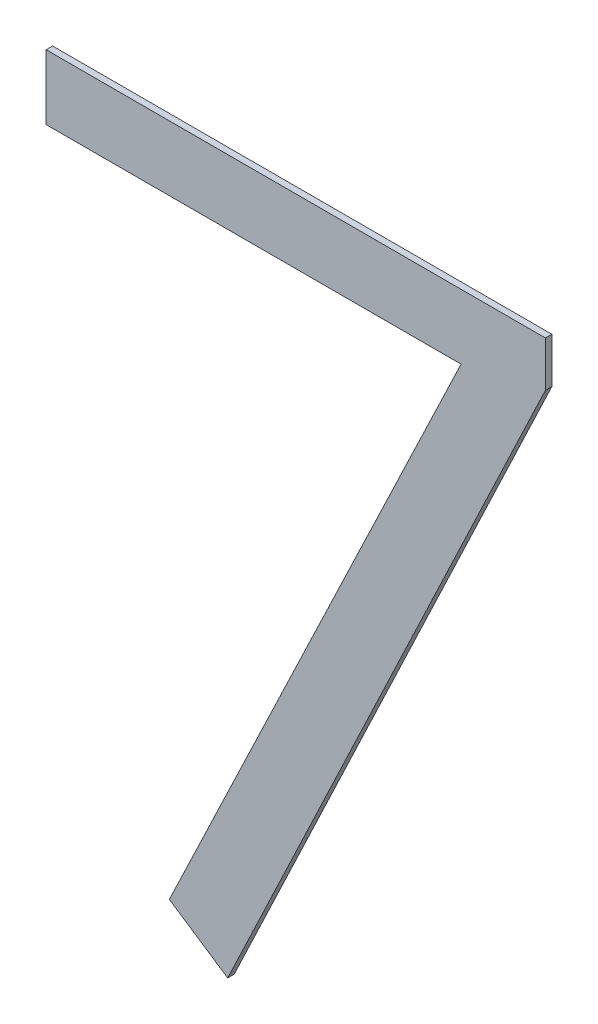
ISO-10303-21;
HEADER;
FILE_DESCRIPTION(('STEP AP214'),'2;1');
FILE_NAME('part.step','',(''),(''),'','','');
FILE_SCHEMA(('AUTOMOTIVE_DESIGN { 1 0 10303 214 1 1 1 1 }'));
ENDSEC;
DATA;
#1=APPLICATION_CONTEXT('core data for automotive mechanical design processes');
#2=APPLICATION_PROTOCOL_DEFINITION('international standard','automotive_design',2000,#1);
#3=PRODUCT_CONTEXT('',#1,'mechanical');
#4=PRODUCT('Part','Part','',(#3));
#5=PRODUCT_RELATED_PRODUCT_CATEGORY('part','',(#4));
#6=PRODUCT_DEFINITION_FORMATION('','',#4);
#7=PRODUCT_DEFINITION_CONTEXT('part definition',#1,'design');
#8=PRODUCT_DEFINITION('design','',#6,#7);
#9=PRODUCT_DEFINITION_SHAPE('','',#8);
#10=(LENGTH_UNIT() NAMED_UNIT(*) SI_UNIT(.MILLI.,.METRE.));
#11=(NAMED_UNIT(*) PLANE_ANGLE_UNIT() SI_UNIT($,.RADIAN.));
#12=(NAMED_UNIT(*) SI_UNIT($,.STERADIAN.) SOLID_ANGLE_UNIT());
#13=UNCERTAINTY_MEASURE_WITH_UNIT(LENGTH_MEASURE(1.E-05),#10,'distance_accuracy_value','');
#14=(GEOMETRIC_REPRESENTATION_CONTEXT(3) GLOBAL_UNCERTAINTY_ASSIGNED_CONTEXT((#13)) GLOBAL_UNIT_ASSIGNED_CONTEXT((#10,
#11,#12)) REPRESENTATION_CONTEXT('',''));
#15=CARTESIAN_POINT('',(0.,0.,0.));
#16=DIRECTION('',(0.,0.,1.));
#17=DIRECTION('',(1.,0.,0.));
#18=AXIS2_PLACEMENT_3D('',#15,#16,#17);
#19=CARTESIAN_POINT('',(-0.3850005,0.55000144,0.01));
#20=DIRECTION('',(0.,0.,1.));
#21=DIRECTION('',(1.,0.,0.));
#22=AXIS2_PLACEMENT_3D('',#19,#20,#21);
#23=PLANE('',#22);
#24=DIRECTION('',(0.,1.,0.));
#25=VECTOR('',#24,1.);
#26=CARTESIAN_POINT('',(0.3850005,0.55000144,0.01));
#27=LINE('',#26,#25);
#28=CARTESIAN_POINT('',(0.3850005,0.55000144,0.01));
#29=VERTEX_POINT('',#28);
#30=CARTESIAN_POINT('',(0.3850005,0.48000158,0.01));
#31=VERTEX_POINT('',#30);
#32=EDGE_CURVE('E107',#29,#31,#27,.F.);
#33=ORIENTED_EDGE('',*,*,#32,.F.);
#34=DIRECTION('',(1.,0.,0.));
#35=VECTOR('',#34,1.);
#36=CARTESIAN_POINT('',(-0.3850005,0.55000144,0.01));
#37=LINE('',#36,#35);
#38=CARTESIAN_POINT('',(-0.3850005,0.55000144,0.01));
#39=VERTEX_POINT('',#38);
#40=EDGE_CURVE('E88',#39,#29,#37,.T.);
#41=ORIENTED_EDGE('',*,*,#40,.F.);
#42=DIRECTION('',(0.,1.,0.));
#43=VECTOR('',#42,1.);
#44=CARTESIAN_POINT('',(-0.3850005,0.45000164,0.01));
#45=LINE('',#44,#43);
#46=CARTESIAN_POINT('',(-0.3850005,0.45000164,0.01));
#47=VERTEX_POINT('',#46);
#48=EDGE_CURVE('E20',#47,#39,#45,.T.);
#49=ORIENTED_EDGE('',*,*,#48,.F.);
#50=DIRECTION('',(1.,0.,0.));
#51=VECTOR('',#50,1.);
#52=CARTESIAN_POINT('',(0.25500076,0.45000164,0.01));
#53=LINE('',#52,#51);
#54=CARTESIAN_POINT('',(0.25500076000003,0.450001639999986,0.01));
#55=VERTEX_POINT('',#54);
#56=EDGE_CURVE('E77',#55,#47,#53,.F.);
#57=ORIENTED_EDGE('',*,*,#56,.F.);
#58=DIRECTION('',(-0.431796031455136,-0.901971278489285,0.));
#59=VECTOR('',#58,1.);
#60=CARTESIAN_POINT('',(-0.19500088,-0.48999902,0.01));
#61=LINE('',#60,#59);
#62=CARTESIAN_POINT('',(-0.195000879999996,-0.489999019999994,0.01));
#63=VERTEX_POINT('',#62);
#64=EDGE_CURVE('E72',#63,#55,#61,.F.);
#65=ORIENTED_EDGE('',*,*,#64,.F.);
#66=DIRECTION('',(0.83205751946603,-0.55468935838002,0.));
#67=VECTOR('',#66,1.);
#68=CARTESIAN_POINT('',(-0.10499852,-0.5499989,0.01));
#69=LINE('',#68,#67);
#70=CARTESIAN_POINT('',(-0.104998520000099,-0.549998899999953,0.01));
#71=VERTEX_POINT('',#70);
#72=EDGE_CURVE('E99',#71,#63,#69,.F.);
#73=ORIENTED_EDGE('',*,*,#72,.F.);
#74=DIRECTION('',(0.429592369181139,0.903022921271291,0.));
#75=VECTOR('',#74,1.);
#76=CARTESIAN_POINT('',(0.3850005,0.48000158,0.01));
#77=LINE('',#76,#75);
#78=EDGE_CURVE('E103',#31,#71,#77,.F.);
#79=ORIENTED_EDGE('',*,*,#78,.F.);
#80=EDGE_LOOP('',(#33,#41,#49,#57,#65,#73,#79));
#81=FACE_BOUND('',#80,.T.);
#82=ADVANCED_FACE('F17',(#81),#23,.T.);
#83=CARTESIAN_POINT('',(-0.3850005,0.45000164,0.));
#84=DIRECTION('',(-1.,0.,0.));
#85=DIRECTION('',(0.,0.,1.));
#86=AXIS2_PLACEMENT_3D('',#83,#84,#85);
#87=PLANE('',#86);
#88=DIRECTION('',(0.,0.,1.));
#89=VECTOR('',#88,1.);
#90=CARTESIAN_POINT('',(-0.3850005,0.55000144,0.));
#91=LINE('',#90,#89);
#92=CARTESIAN_POINT('',(-0.3850005,0.55000144,0.));
#93=VERTEX_POINT('',#92);
#94=EDGE_CURVE('E111',#93,#39,#91,.T.);
#95=ORIENTED_EDGE('',*,*,#94,.F.);
#96=DIRECTION('',(0.,1.,0.));
#97=VECTOR('',#96,1.);
#98=CARTESIAN_POINT('',(-0.3850005,0.55000144,0.));
#99=LINE('',#98,#97);
#100=CARTESIAN_POINT('',(-0.3850005,0.45000164,0.));
#101=VERTEX_POINT('',#100);
#102=EDGE_CURVE('E94',#93,#101,#99,.F.);
#103=ORIENTED_EDGE('',*,*,#102,.T.);
#104=DIRECTION('',(0.,0.,-1.));
#105=VECTOR('',#104,1.);
#106=CARTESIAN_POINT('',(-0.3850005,0.45000164,0.));
#107=LINE('',#106,#105);
#108=EDGE_CURVE('E82',#47,#101,#107,.T.);
#109=ORIENTED_EDGE('',*,*,#108,.F.);
#110=ORIENTED_EDGE('',*,*,#48,.T.);
#111=EDGE_LOOP('',(#95,#103,#109,#110));
#112=FACE_BOUND('',#111,.T.);
#113=ADVANCED_FACE('F93',(#112),#87,.T.);
#114=CARTESIAN_POINT('',(0.25500076,0.45000164,0.));
#115=DIRECTION('',(0.,-1.,0.));
#116=DIRECTION('',(0.,0.,-1.));
#117=AXIS2_PLACEMENT_3D('',#114,#115,#116);
#118=PLANE('',#117);
#119=ORIENTED_EDGE('',*,*,#108,.T.);
#120=DIRECTION('',(1.,0.,0.));
#121=VECTOR('',#120,1.);
#122=CARTESIAN_POINT('',(-0.3850005,0.45000164,0.));
#123=LINE('',#122,#121);
#124=CARTESIAN_POINT('',(0.25500076000003,0.450001639999986,0.));
#125=VERTEX_POINT('',#124);
#126=EDGE_CURVE('E116',#101,#125,#123,.T.);
#127=ORIENTED_EDGE('',*,*,#126,.T.);
#128=DIRECTION('',(0.,0.,1.));
#129=VECTOR('',#128,1.);
#130=CARTESIAN_POINT('',(0.255000760000121,0.450001639999942,0.));
#131=LINE('',#130,#129);
#132=EDGE_CURVE('E84',#55,#125,#131,.F.);
#133=ORIENTED_EDGE('',*,*,#132,.F.);
#134=ORIENTED_EDGE('',*,*,#56,.T.);
#135=EDGE_LOOP('',(#119,#127,#133,#134));
#136=FACE_BOUND('',#135,.T.);
#137=ADVANCED_FACE('F79',(#136),#118,.T.);
#138=CARTESIAN_POINT('',(-0.19500088,-0.48999902,0.));
#139=DIRECTION('',(-0.901971278489285,0.431796031455136,0.));
#140=DIRECTION('',(-0.431796031455136,-0.901971278489285,0.));
#141=AXIS2_PLACEMENT_3D('',#138,#139,#140);
#142=PLANE('',#141);
#143=ORIENTED_EDGE('',*,*,#132,.T.);
#144=DIRECTION('',(-0.43179603145502,-0.90197127848934,0.));
#145=VECTOR('',#144,1.);
#146=CARTESIAN_POINT('',(0.25500076,0.45000164,0.));
#147=LINE('',#146,#145);
#148=CARTESIAN_POINT('',(-0.195000879999996,-0.489999019999994,0.));
#149=VERTEX_POINT('',#148);
#150=EDGE_CURVE('E118',#125,#149,#147,.T.);
#151=ORIENTED_EDGE('',*,*,#150,.T.);
#152=DIRECTION('',(0.,0.,1.));
#153=VECTOR('',#152,1.);
#154=CARTESIAN_POINT('',(-0.195000879999984,-0.489999019999977,0.));
#155=LINE('',#154,#153);
#156=EDGE_CURVE('E101',#63,#149,#155,.F.);
#157=ORIENTED_EDGE('',*,*,#156,.F.);
#158=ORIENTED_EDGE('',*,*,#64,.T.);
#159=EDGE_LOOP('',(#143,#151,#157,#158));
#160=FACE_BOUND('',#159,.T.);
#161=ADVANCED_FACE('F144',(#160),#142,.T.);
#162=CARTESIAN_POINT('',(-0.10499852,-0.5499989,0.));
#163=DIRECTION('',(-0.55468935838002,-0.83205751946603,0.));
#164=DIRECTION('',(0.83205751946603,-0.55468935838002,0.));
#165=AXIS2_PLACEMENT_3D('',#162,#163,#164);
#166=PLANE('',#165);
#167=ORIENTED_EDGE('',*,*,#156,.T.);
#168=DIRECTION('',(0.832057519466175,-0.554689358379802,0.));
#169=VECTOR('',#168,1.);
#170=CARTESIAN_POINT('',(-0.19500088,-0.48999902,0.));
#171=LINE('',#170,#169);
#172=CARTESIAN_POINT('',(-0.104998520000099,-0.549998899999953,0.));
#173=VERTEX_POINT('',#172);
#174=EDGE_CURVE('E121',#149,#173,#171,.T.);
#175=ORIENTED_EDGE('',*,*,#174,.T.);
#176=DIRECTION('',(0.,0.,1.));
#177=VECTOR('',#176,1.);
#178=CARTESIAN_POINT('',(-0.104998520000397,-0.549998899999811,0.));
#179=LINE('',#178,#177);
#180=EDGE_CURVE('E105',#71,#173,#179,.F.);
#181=ORIENTED_EDGE('',*,*,#180,.F.);
#182=ORIENTED_EDGE('',*,*,#72,.T.);
#183=EDGE_LOOP('',(#167,#175,#181,#182));
#184=FACE_BOUND('',#183,.T.);
#185=ADVANCED_FACE('F142',(#184),#166,.T.);
#186=CARTESIAN_POINT('',(0.3850005,0.48000158,0.));
#187=DIRECTION('',(0.903022921271291,-0.429592369181139,0.));
#188=DIRECTION('',(0.429592369181139,0.903022921271291,0.));
#189=AXIS2_PLACEMENT_3D('',#186,#187,#188);
#190=PLANE('',#189);
#191=ORIENTED_EDGE('',*,*,#180,.T.);
#192=DIRECTION('',(0.42959236918079,0.903022921271457,0.));
#193=VECTOR('',#192,1.);
#194=CARTESIAN_POINT('',(-0.10499852,-0.5499989,0.));
#195=LINE('',#194,#193);
#196=CARTESIAN_POINT('',(0.3850005,0.48000158,0.));
#197=VERTEX_POINT('',#196);
#198=EDGE_CURVE('E124',#173,#197,#195,.T.);
#199=ORIENTED_EDGE('',*,*,#198,.T.);
#200=DIRECTION('',(0.,0.,-1.));
#201=VECTOR('',#200,1.);
#202=CARTESIAN_POINT('',(0.3850005,0.48000158,0.));
#203=LINE('',#202,#201);
#204=EDGE_CURVE('E109',#31,#197,#203,.T.);
#205=ORIENTED_EDGE('',*,*,#204,.F.);
#206=ORIENTED_EDGE('',*,*,#78,.T.);
#207=EDGE_LOOP('',(#191,#199,#205,#206));
#208=FACE_BOUND('',#207,.T.);
#209=ADVANCED_FACE('F137',(#208),#190,.T.);
#210=CARTESIAN_POINT('',(0.3850005,0.55000144,0.));
#211=DIRECTION('',(1.,0.,0.));
#212=DIRECTION('',(0.,0.,-1.));
#213=AXIS2_PLACEMENT_3D('',#210,#211,#212);
#214=PLANE('',#213);
#215=ORIENTED_EDGE('',*,*,#204,.T.);
#216=DIRECTION('',(0.,1.,0.));
#217=VECTOR('',#216,1.);
#218=CARTESIAN_POINT('',(0.3850005,0.55000144,0.));
#219=LINE('',#218,#217);
#220=CARTESIAN_POINT('',(0.3850005,0.55000144,0.));
#221=VERTEX_POINT('',#220);
#222=EDGE_CURVE('E26',#197,#221,#219,.T.);
#223=ORIENTED_EDGE('',*,*,#222,.T.);
#224=DIRECTION('',(0.,0.,1.));
#225=VECTOR('',#224,1.);
#226=CARTESIAN_POINT('',(0.3850005,0.55000144,0.));
#227=LINE('',#226,#225);
#228=EDGE_CURVE('E34',#29,#221,#227,.F.);
#229=ORIENTED_EDGE('',*,*,#228,.F.);
#230=ORIENTED_EDGE('',*,*,#32,.T.);
#231=EDGE_LOOP('',(#215,#223,#229,#230));
#232=FACE_BOUND('',#231,.T.);
#233=ADVANCED_FACE('F130',(#232),#214,.T.);
#234=CARTESIAN_POINT('',(-0.3850005,0.55000144,0.));
#235=DIRECTION('',(0.,1.,0.));
#236=DIRECTION('',(0.,0.,1.));
#237=AXIS2_PLACEMENT_3D('',#234,#235,#236);
#238=PLANE('',#237);
#239=ORIENTED_EDGE('',*,*,#228,.T.);
#240=DIRECTION('',(1.,0.,0.));
#241=VECTOR('',#240,1.);
#242=CARTESIAN_POINT('',(-0.3850005,0.55000144,0.));
#243=LINE('',#242,#241);
#244=EDGE_CURVE('E11',#221,#93,#243,.F.);
#245=ORIENTED_EDGE('',*,*,#244,.T.);
#246=ORIENTED_EDGE('',*,*,#94,.T.);
#247=ORIENTED_EDGE('',*,*,#40,.T.);
#248=EDGE_LOOP('',(#239,#245,#246,#247));
#249=FACE_BOUND('',#248,.T.);
#250=ADVANCED_FACE('F155',(#249),#238,.T.);
#251=CARTESIAN_POINT('',(-0.3850005,0.55000144,0.));
#252=DIRECTION('',(0.,0.,1.));
#253=DIRECTION('',(1.,0.,0.));
#254=AXIS2_PLACEMENT_3D('',#251,#252,#253);
#255=PLANE('',#254);
#256=ORIENTED_EDGE('',*,*,#222,.F.);
#257=ORIENTED_EDGE('',*,*,#198,.F.);
#258=ORIENTED_EDGE('',*,*,#174,.F.);
#259=ORIENTED_EDGE('',*,*,#150,.F.);
#260=ORIENTED_EDGE('',*,*,#126,.F.);
#261=ORIENTED_EDGE('',*,*,#102,.F.);
#262=ORIENTED_EDGE('',*,*,#244,.F.);
#263=EDGE_LOOP('',(#256,#257,#258,#259,#260,#261,#262));
#264=FACE_BOUND('',#263,.T.);
#265=ADVANCED_FACE('F134',(#264),#255,.F.);
#266=CLOSED_SHELL('',(#82,#113,#137,#161,#185,#209,#233,#250,#265));
#267=MANIFOLD_SOLID_BREP('B1',#266);
#268=ADVANCED_BREP_SHAPE_REPRESENTATION('',(#18,#267),#14);
#269=SHAPE_DEFINITION_REPRESENTATION(#9,#268);
ENDSEC;
END-ISO-10303-21;
